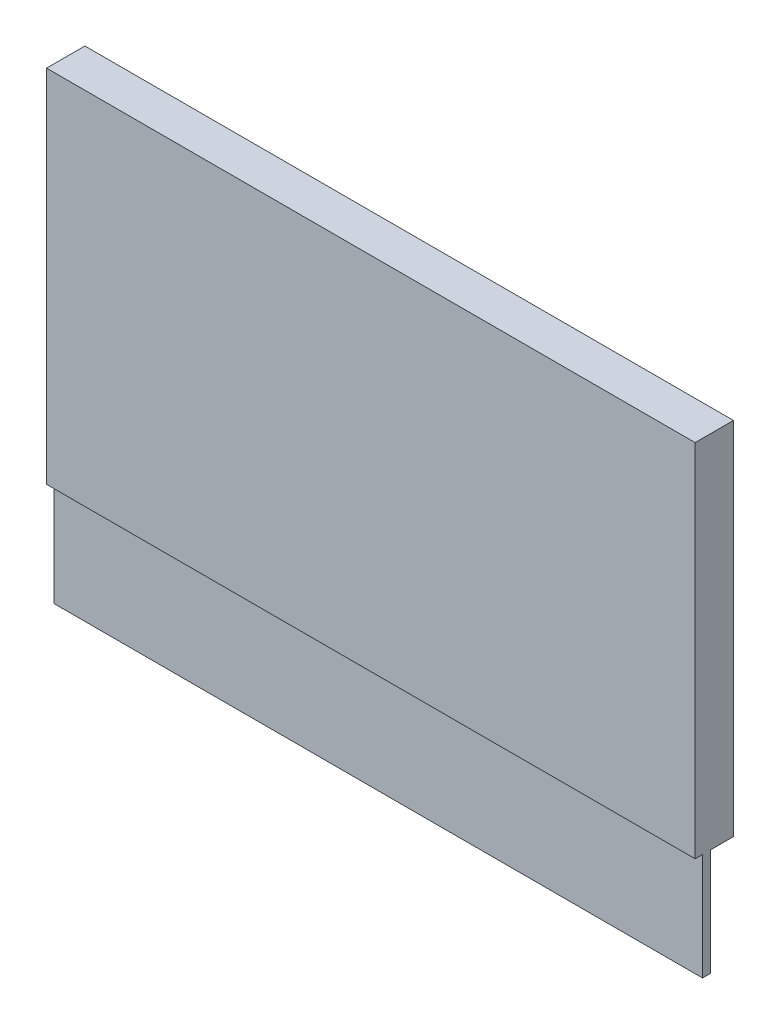
ISO-10303-21;
HEADER;
FILE_DESCRIPTION(('STEP AP214'),'2;1');
FILE_NAME('part.step','',(''),(''),'','','');
FILE_SCHEMA(('AUTOMOTIVE_DESIGN { 1 0 10303 214 1 1 1 1 }'));
ENDSEC;
DATA;
#1=APPLICATION_CONTEXT('core data for automotive mechanical design processes');
#2=APPLICATION_PROTOCOL_DEFINITION('international standard','automotive_design',2000,#1);
#3=PRODUCT_CONTEXT('',#1,'mechanical');
#4=PRODUCT('Part','Part','',(#3));
#5=PRODUCT_RELATED_PRODUCT_CATEGORY('part','',(#4));
#6=PRODUCT_DEFINITION_FORMATION('','',#4);
#7=PRODUCT_DEFINITION_CONTEXT('part definition',#1,'design');
#8=PRODUCT_DEFINITION('design','',#6,#7);
#9=PRODUCT_DEFINITION_SHAPE('','',#8);
#10=(LENGTH_UNIT() NAMED_UNIT(*) SI_UNIT(.MILLI.,.METRE.));
#11=(NAMED_UNIT(*) PLANE_ANGLE_UNIT() SI_UNIT($,.RADIAN.));
#12=(NAMED_UNIT(*) SI_UNIT($,.STERADIAN.) SOLID_ANGLE_UNIT());
#13=UNCERTAINTY_MEASURE_WITH_UNIT(LENGTH_MEASURE(1.E-05),#10,'distance_accuracy_value','');
#14=(GEOMETRIC_REPRESENTATION_CONTEXT(3) GLOBAL_UNCERTAINTY_ASSIGNED_CONTEXT((#13)) GLOBAL_UNIT_ASSIGNED_CONTEXT((#10,
#11,#12)) REPRESENTATION_CONTEXT('',''));
#15=CARTESIAN_POINT('',(0.,0.,0.));
#16=DIRECTION('',(0.,0.,1.));
#17=DIRECTION('',(1.,0.,0.));
#18=AXIS2_PLACEMENT_3D('',#15,#16,#17);
#19=CARTESIAN_POINT('',(13.3223,-9.60120000000001,1.5748));
#20=DIRECTION('',(0.,-1.,0.));
#21=DIRECTION('',(0.,0.,-1.));
#22=AXIS2_PLACEMENT_3D('',#19,#20,#21);
#23=PLANE('',#22);
#24=DIRECTION('',(1.,0.,0.));
#25=VECTOR('',#24,1.);
#26=CARTESIAN_POINT('',(0.,-9.60120000000001,1.27));
#27=LINE('',#26,#25);
#28=CARTESIAN_POINT('',(-13.3223,-9.60120000000001,1.27));
#29=VERTEX_POINT('',#28);
#30=CARTESIAN_POINT('',(13.3223,-9.60120000000001,1.27));
#31=VERTEX_POINT('',#30);
#32=EDGE_CURVE('E89',#29,#31,#27,.T.);
#33=ORIENTED_EDGE('',*,*,#32,.F.);
#34=DIRECTION('',(0.,0.,-1.));
#35=VECTOR('',#34,1.);
#36=CARTESIAN_POINT('',(-13.3223,-9.60120000000001,1.5748));
#37=LINE('',#36,#35);
#38=CARTESIAN_POINT('',(-13.3223,-9.60120000000001,0.9398));
#39=VERTEX_POINT('',#38);
#40=EDGE_CURVE('E85',#29,#39,#37,.T.);
#41=ORIENTED_EDGE('',*,*,#40,.T.);
#42=DIRECTION('',(-1.,0.,0.));
#43=VECTOR('',#42,1.);
#44=CARTESIAN_POINT('',(0.,-9.60120000000001,0.9398));
#45=LINE('',#44,#43);
#46=CARTESIAN_POINT('',(13.3223,-9.60120000000001,0.9398));
#47=VERTEX_POINT('',#46);
#48=EDGE_CURVE('E86',#47,#39,#45,.T.);
#49=ORIENTED_EDGE('',*,*,#48,.F.);
#50=DIRECTION('',(0.,0.,-1.));
#51=VECTOR('',#50,1.);
#52=CARTESIAN_POINT('',(13.3223,-9.60120000000001,1.5748));
#53=LINE('',#52,#51);
#54=EDGE_CURVE('E20',#47,#31,#53,.F.);
#55=ORIENTED_EDGE('',*,*,#54,.T.);
#56=EDGE_LOOP('',(#33,#41,#49,#55));
#57=FACE_BOUND('',#56,.T.);
#58=ADVANCED_FACE('F17',(#57),#23,.T.);
#59=CARTESIAN_POINT('',(13.3223,-5.20700000000001,1.27));
#60=DIRECTION('',(0.,1.,0.));
#61=DIRECTION('',(-1.,0.,0.));
#62=AXIS2_PLACEMENT_3D('',#59,#60,#61);
#63=PLANE('',#62);
#64=DIRECTION('',(0.,0.,1.));
#65=VECTOR('',#64,1.);
#66=CARTESIAN_POINT('',(-13.3223,-5.20700000000001,1.27));
#67=LINE('',#66,#65);
#68=CARTESIAN_POINT('',(-13.3223,-5.20700000000001,1.27));
#69=VERTEX_POINT('',#68);
#70=CARTESIAN_POINT('',(-13.3223,-5.20700000000001,1.5748));
#71=VERTEX_POINT('',#70);
#72=EDGE_CURVE('E98',#69,#71,#67,.T.);
#73=ORIENTED_EDGE('',*,*,#72,.F.);
#74=DIRECTION('',(1.,0.,0.));
#75=VECTOR('',#74,1.);
#76=CARTESIAN_POINT('',(0.,-5.20700000000001,1.27));
#77=LINE('',#76,#75);
#78=CARTESIAN_POINT('',(13.3223,-5.20700000000001,1.27));
#79=VERTEX_POINT('',#78);
#80=EDGE_CURVE('E109',#79,#69,#77,.F.);
#81=ORIENTED_EDGE('',*,*,#80,.F.);
#82=DIRECTION('',(0.,0.,1.));
#83=VECTOR('',#82,1.);
#84=CARTESIAN_POINT('',(13.3223,-5.20700000000001,1.27));
#85=LINE('',#84,#83);
#86=CARTESIAN_POINT('',(13.3223,-5.20700000000001,1.5748));
#87=VERTEX_POINT('',#86);
#88=EDGE_CURVE('E93',#87,#79,#85,.F.);
#89=ORIENTED_EDGE('',*,*,#88,.F.);
#90=DIRECTION('',(-1.,0.,0.));
#91=VECTOR('',#90,1.);
#92=CARTESIAN_POINT('',(0.,-5.20700000000001,1.5748));
#93=LINE('',#92,#91);
#94=EDGE_CURVE('E97',#87,#71,#93,.T.);
#95=ORIENTED_EDGE('',*,*,#94,.T.);
#96=EDGE_LOOP('',(#73,#81,#89,#95));
#97=FACE_BOUND('',#96,.T.);
#98=ADVANCED_FACE('F130',(#97),#63,.F.);
#99=CARTESIAN_POINT('',(0.,0.,0.9398));
#100=DIRECTION('',(0.,0.,-1.));
#101=DIRECTION('',(-1.,0.,0.));
#102=AXIS2_PLACEMENT_3D('',#99,#100,#101);
#103=PLANE('',#102);
#104=DIRECTION('',(0.,1.,0.));
#105=VECTOR('',#104,1.);
#106=CARTESIAN_POINT('',(-13.3223,-9.60120000000001,0.9398));
#107=LINE('',#106,#105);
#108=CARTESIAN_POINT('',(-13.3223,-5.20700000000001,0.9398));
#109=VERTEX_POINT('',#108);
#110=EDGE_CURVE('E79',#109,#39,#107,.F.);
#111=ORIENTED_EDGE('',*,*,#110,.F.);
#112=DIRECTION('',(-1.,0.,0.));
#113=VECTOR('',#112,1.);
#114=CARTESIAN_POINT('',(-13.3223,-5.20700000000001,0.9398));
#115=LINE('',#114,#113);
#116=CARTESIAN_POINT('',(13.3223,-5.20700000000001,0.9398));
#117=VERTEX_POINT('',#116);
#118=EDGE_CURVE('E105',#109,#117,#115,.F.);
#119=ORIENTED_EDGE('',*,*,#118,.T.);
#120=DIRECTION('',(0.,1.,0.));
#121=VECTOR('',#120,1.);
#122=CARTESIAN_POINT('',(13.3223,9.60120000000001,0.9398));
#123=LINE('',#122,#121);
#124=EDGE_CURVE('E96',#47,#117,#123,.T.);
#125=ORIENTED_EDGE('',*,*,#124,.F.);
#126=ORIENTED_EDGE('',*,*,#48,.T.);
#127=EDGE_LOOP('',(#111,#119,#125,#126));
#128=FACE_BOUND('',#127,.T.);
#129=ADVANCED_FACE('F94',(#128),#103,.T.);
#130=CARTESIAN_POINT('',(0.,0.,1.5748));
#131=DIRECTION('',(0.,0.,-1.));
#132=DIRECTION('',(-1.,0.,0.));
#133=AXIS2_PLACEMENT_3D('',#130,#131,#132);
#134=PLANE('',#133);
#135=DIRECTION('',(0.,1.,0.));
#136=VECTOR('',#135,1.);
#137=CARTESIAN_POINT('',(13.3223,9.60120000000001,1.5748));
#138=LINE('',#137,#136);
#139=CARTESIAN_POINT('',(13.3223,9.60120000000001,1.5748));
#140=VERTEX_POINT('',#139);
#141=EDGE_CURVE('E127',#140,#87,#138,.F.);
#142=ORIENTED_EDGE('',*,*,#141,.F.);
#143=DIRECTION('',(1.,0.,0.));
#144=VECTOR('',#143,1.);
#145=CARTESIAN_POINT('',(-13.3223,9.60120000000001,1.5748));
#146=LINE('',#145,#144);
#147=CARTESIAN_POINT('',(-13.3223,9.60120000000001,1.5748));
#148=VERTEX_POINT('',#147);
#149=EDGE_CURVE('E146',#148,#140,#146,.T.);
#150=ORIENTED_EDGE('',*,*,#149,.F.);
#151=DIRECTION('',(0.,1.,0.));
#152=VECTOR('',#151,1.);
#153=CARTESIAN_POINT('',(-13.3223,-9.60120000000001,1.5748));
#154=LINE('',#153,#152);
#155=EDGE_CURVE('E107',#71,#148,#154,.T.);
#156=ORIENTED_EDGE('',*,*,#155,.F.);
#157=ORIENTED_EDGE('',*,*,#94,.F.);
#158=EDGE_LOOP('',(#142,#150,#156,#157));
#159=FACE_BOUND('',#158,.T.);
#160=ADVANCED_FACE('F154',(#159),#134,.F.);
#161=CARTESIAN_POINT('',(0.,0.,1.27));
#162=DIRECTION('',(0.,0.,1.));
#163=DIRECTION('',(1.,0.,0.));
#164=AXIS2_PLACEMENT_3D('',#161,#162,#163);
#165=PLANE('',#164);
#166=DIRECTION('',(0.,1.,0.));
#167=VECTOR('',#166,1.);
#168=CARTESIAN_POINT('',(13.3223,9.60120000000001,1.27));
#169=LINE('',#168,#167);
#170=EDGE_CURVE('E125',#79,#31,#169,.F.);
#171=ORIENTED_EDGE('',*,*,#170,.F.);
#172=ORIENTED_EDGE('',*,*,#80,.T.);
#173=DIRECTION('',(0.,1.,0.));
#174=VECTOR('',#173,1.);
#175=CARTESIAN_POINT('',(-13.3223,-9.60120000000001,1.27));
#176=LINE('',#175,#174);
#177=EDGE_CURVE('E104',#29,#69,#176,.T.);
#178=ORIENTED_EDGE('',*,*,#177,.F.);
#179=ORIENTED_EDGE('',*,*,#32,.T.);
#180=EDGE_LOOP('',(#171,#172,#178,#179));
#181=FACE_BOUND('',#180,.T.);
#182=ADVANCED_FACE('F132',(#181),#165,.T.);
#183=CARTESIAN_POINT('',(-13.3223,-5.20700000000001,0.9398));
#184=DIRECTION('',(0.,1.,0.));
#185=DIRECTION('',(-1.,0.,0.));
#186=AXIS2_PLACEMENT_3D('',#183,#184,#185);
#187=PLANE('',#186);
#188=DIRECTION('',(0.,0.,-1.));
#189=VECTOR('',#188,1.);
#190=CARTESIAN_POINT('',(13.3223,-5.20700000000002,1.5748));
#191=LINE('',#190,#189);
#192=CARTESIAN_POINT('',(13.3223,-5.20700000000002,0.));
#193=VERTEX_POINT('',#192);
#194=EDGE_CURVE('E142',#117,#193,#191,.T.);
#195=ORIENTED_EDGE('',*,*,#194,.F.);
#196=ORIENTED_EDGE('',*,*,#118,.F.);
#197=DIRECTION('',(0.,0.,1.));
#198=VECTOR('',#197,1.);
#199=CARTESIAN_POINT('',(-13.3223,-5.20700000000001,1.5748));
#200=LINE('',#199,#198);
#201=CARTESIAN_POINT('',(-13.3223,-5.20700000000001,0.));
#202=VERTEX_POINT('',#201);
#203=EDGE_CURVE('E103',#202,#109,#200,.T.);
#204=ORIENTED_EDGE('',*,*,#203,.F.);
#205=DIRECTION('',(-1.,0.,0.));
#206=VECTOR('',#205,1.);
#207=CARTESIAN_POINT('',(0.,-5.20700000000002,0.));
#208=LINE('',#207,#206);
#209=EDGE_CURVE('E133',#193,#202,#208,.T.);
#210=ORIENTED_EDGE('',*,*,#209,.F.);
#211=EDGE_LOOP('',(#195,#196,#204,#210));
#212=FACE_BOUND('',#211,.T.);
#213=ADVANCED_FACE('F163',(#212),#187,.F.);
#214=CARTESIAN_POINT('',(-13.3223,-9.60120000000001,1.5748));
#215=DIRECTION('',(-1.,0.,0.));
#216=DIRECTION('',(0.,0.,1.));
#217=AXIS2_PLACEMENT_3D('',#214,#215,#216);
#218=PLANE('',#217);
#219=DIRECTION('',(0.,1.,0.));
#220=VECTOR('',#219,1.);
#221=CARTESIAN_POINT('',(-13.3223,0.,0.));
#222=LINE('',#221,#220);
#223=CARTESIAN_POINT('',(-13.3223,9.60120000000001,0.));
#224=VERTEX_POINT('',#223);
#225=EDGE_CURVE('E136',#202,#224,#222,.T.);
#226=ORIENTED_EDGE('',*,*,#225,.F.);
#227=ORIENTED_EDGE('',*,*,#203,.T.);
#228=ORIENTED_EDGE('',*,*,#110,.T.);
#229=ORIENTED_EDGE('',*,*,#40,.F.);
#230=ORIENTED_EDGE('',*,*,#177,.T.);
#231=ORIENTED_EDGE('',*,*,#72,.T.);
#232=ORIENTED_EDGE('',*,*,#155,.T.);
#233=DIRECTION('',(0.,0.,1.));
#234=VECTOR('',#233,1.);
#235=CARTESIAN_POINT('',(-13.3223,9.60120000000001,1.5748));
#236=LINE('',#235,#234);
#237=EDGE_CURVE('E148',#224,#148,#236,.T.);
#238=ORIENTED_EDGE('',*,*,#237,.F.);
#239=EDGE_LOOP('',(#226,#227,#228,#229,#230,#231,#232,#238));
#240=FACE_BOUND('',#239,.T.);
#241=ADVANCED_FACE('F102',(#240),#218,.T.);
#242=CARTESIAN_POINT('',(-13.3223,9.60120000000001,1.5748));
#243=DIRECTION('',(0.,1.,0.));
#244=DIRECTION('',(0.,0.,1.));
#245=AXIS2_PLACEMENT_3D('',#242,#243,#244);
#246=PLANE('',#245);
#247=ORIENTED_EDGE('',*,*,#149,.T.);
#248=DIRECTION('',(0.,0.,-1.));
#249=VECTOR('',#248,1.);
#250=CARTESIAN_POINT('',(13.3223,9.60120000000001,1.5748));
#251=LINE('',#250,#249);
#252=CARTESIAN_POINT('',(13.3223,9.60120000000001,0.));
#253=VERTEX_POINT('',#252);
#254=EDGE_CURVE('E35',#253,#140,#251,.F.);
#255=ORIENTED_EDGE('',*,*,#254,.F.);
#256=DIRECTION('',(-1.,0.,0.));
#257=VECTOR('',#256,1.);
#258=CARTESIAN_POINT('',(0.,9.60120000000001,0.));
#259=LINE('',#258,#257);
#260=EDGE_CURVE('E26',#224,#253,#259,.F.);
#261=ORIENTED_EDGE('',*,*,#260,.F.);
#262=ORIENTED_EDGE('',*,*,#237,.T.);
#263=EDGE_LOOP('',(#247,#255,#261,#262));
#264=FACE_BOUND('',#263,.T.);
#265=ADVANCED_FACE('F155',(#264),#246,.T.);
#266=CARTESIAN_POINT('',(13.3223,9.60120000000001,1.5748));
#267=DIRECTION('',(1.,0.,0.));
#268=DIRECTION('',(0.,0.,-1.));
#269=AXIS2_PLACEMENT_3D('',#266,#267,#268);
#270=PLANE('',#269);
#271=ORIENTED_EDGE('',*,*,#170,.T.);
#272=ORIENTED_EDGE('',*,*,#54,.F.);
#273=ORIENTED_EDGE('',*,*,#124,.T.);
#274=ORIENTED_EDGE('',*,*,#194,.T.);
#275=DIRECTION('',(0.,1.,0.));
#276=VECTOR('',#275,1.);
#277=CARTESIAN_POINT('',(13.3223,0.,0.));
#278=LINE('',#277,#276);
#279=EDGE_CURVE('E11',#253,#193,#278,.F.);
#280=ORIENTED_EDGE('',*,*,#279,.F.);
#281=ORIENTED_EDGE('',*,*,#254,.T.);
#282=ORIENTED_EDGE('',*,*,#141,.T.);
#283=ORIENTED_EDGE('',*,*,#88,.T.);
#284=EDGE_LOOP('',(#271,#272,#273,#274,#280,#281,#282,#283));
#285=FACE_BOUND('',#284,.T.);
#286=ADVANCED_FACE('F123',(#285),#270,.T.);
#287=CARTESIAN_POINT('',(0.,0.,0.));
#288=DIRECTION('',(0.,0.,-1.));
#289=DIRECTION('',(-1.,0.,0.));
#290=AXIS2_PLACEMENT_3D('',#287,#288,#289);
#291=PLANE('',#290);
#292=ORIENTED_EDGE('',*,*,#260,.T.);
#293=ORIENTED_EDGE('',*,*,#279,.T.);
#294=ORIENTED_EDGE('',*,*,#209,.T.);
#295=ORIENTED_EDGE('',*,*,#225,.T.);
#296=EDGE_LOOP('',(#292,#293,#294,#295));
#297=FACE_BOUND('',#296,.T.);
#298=ADVANCED_FACE('F160',(#297),#291,.T.);
#299=CLOSED_SHELL('',(#58,#98,#129,#160,#182,#213,#241,#265,#286,#298));
#300=MANIFOLD_SOLID_BREP('B1',#299);
#301=ADVANCED_BREP_SHAPE_REPRESENTATION('',(#18,#300),#14);
#302=SHAPE_DEFINITION_REPRESENTATION(#9,#301);
ENDSEC;
END-ISO-10303-21;
